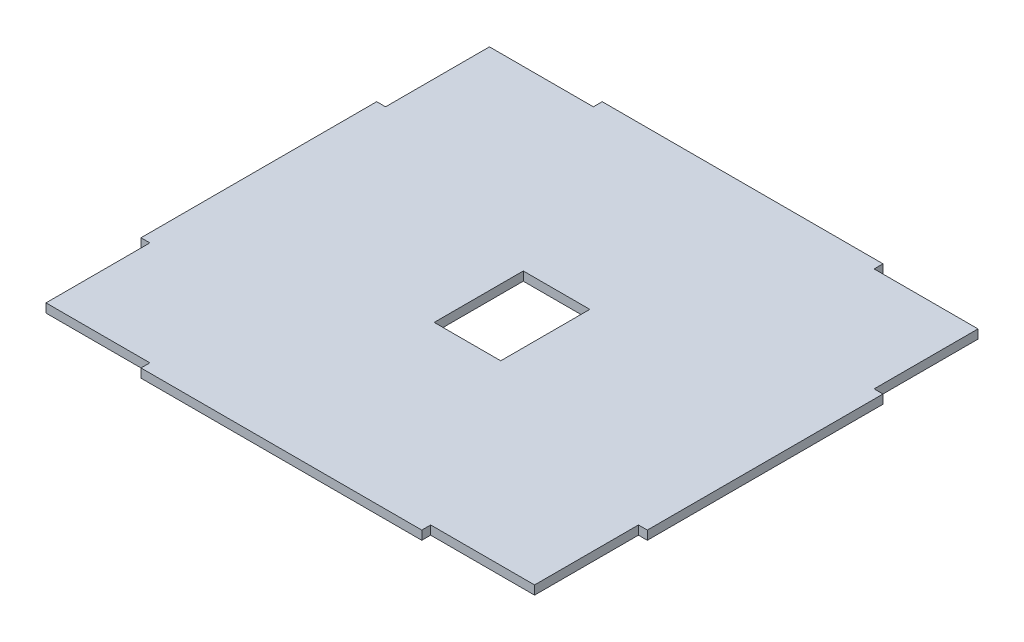
ISO-10303-21;
HEADER;
FILE_DESCRIPTION(('STEP AP214'),'2;1');
FILE_NAME('part.step','',(''),(''),'','','');
FILE_SCHEMA(('AUTOMOTIVE_DESIGN { 1 0 10303 214 1 1 1 1 }'));
ENDSEC;
DATA;
#1=APPLICATION_CONTEXT('core data for automotive mechanical design processes');
#2=APPLICATION_PROTOCOL_DEFINITION('international standard','automotive_design',2000,#1);
#3=PRODUCT_CONTEXT('',#1,'mechanical');
#4=PRODUCT('Part','Part','',(#3));
#5=PRODUCT_RELATED_PRODUCT_CATEGORY('part','',(#4));
#6=PRODUCT_DEFINITION_FORMATION('','',#4);
#7=PRODUCT_DEFINITION_CONTEXT('part definition',#1,'design');
#8=PRODUCT_DEFINITION('design','',#6,#7);
#9=PRODUCT_DEFINITION_SHAPE('','',#8);
#10=(LENGTH_UNIT() NAMED_UNIT(*) SI_UNIT(.MILLI.,.METRE.));
#11=(NAMED_UNIT(*) PLANE_ANGLE_UNIT() SI_UNIT($,.RADIAN.));
#12=(NAMED_UNIT(*) SI_UNIT($,.STERADIAN.) SOLID_ANGLE_UNIT());
#13=UNCERTAINTY_MEASURE_WITH_UNIT(LENGTH_MEASURE(1.E-05),#10,'distance_accuracy_value','');
#14=(GEOMETRIC_REPRESENTATION_CONTEXT(3) GLOBAL_UNCERTAINTY_ASSIGNED_CONTEXT((#13)) GLOBAL_UNIT_ASSIGNED_CONTEXT((#10,
#11,#12)) REPRESENTATION_CONTEXT('',''));
#15=CARTESIAN_POINT('',(0.,0.,0.));
#16=DIRECTION('',(0.,0.,1.));
#17=DIRECTION('',(1.,0.,0.));
#18=AXIS2_PLACEMENT_3D('',#15,#16,#17);
#19=CARTESIAN_POINT('',(0.,2.,-49.943));
#20=DIRECTION('',(0.,0.,-1.));
#21=DIRECTION('',(-1.,0.,0.));
#22=AXIS2_PLACEMENT_3D('',#19,#20,#21);
#23=PLANE('',#22);
#24=DIRECTION('',(1.,0.,0.));
#25=VECTOR('',#24,1.);
#26=CARTESIAN_POINT('',(0.,0.,-49.943));
#27=LINE('',#26,#25);
#28=CARTESIAN_POINT('',(31.623,0.,-49.943));
#29=VERTEX_POINT('',#28);
#30=CARTESIAN_POINT('',(55.023,0.,-49.943));
#31=VERTEX_POINT('',#30);
#32=EDGE_CURVE('E246',#29,#31,#27,.T.);
#33=ORIENTED_EDGE('',*,*,#32,.F.);
#34=DIRECTION('',(0.,-1.,0.));
#35=VECTOR('',#34,1.);
#36=CARTESIAN_POINT('',(31.623,2.,-49.943));
#37=LINE('',#36,#35);
#38=CARTESIAN_POINT('',(31.623,2.,-49.943));
#39=VERTEX_POINT('',#38);
#40=EDGE_CURVE('E11',#39,#29,#37,.T.);
#41=ORIENTED_EDGE('',*,*,#40,.F.);
#42=DIRECTION('',(1.,0.,0.));
#43=VECTOR('',#42,1.);
#44=CARTESIAN_POINT('',(0.,2.,-49.943));
#45=LINE('',#44,#43);
#46=CARTESIAN_POINT('',(55.023,2.,-49.943));
#47=VERTEX_POINT('',#46);
#48=EDGE_CURVE('E364',#39,#47,#45,.T.);
#49=ORIENTED_EDGE('',*,*,#48,.T.);
#50=DIRECTION('',(0.,-1.,0.));
#51=VECTOR('',#50,1.);
#52=CARTESIAN_POINT('',(55.023,2.,-49.943));
#53=LINE('',#52,#51);
#54=EDGE_CURVE('E140',#47,#31,#53,.T.);
#55=ORIENTED_EDGE('',*,*,#54,.T.);
#56=EDGE_LOOP('',(#33,#41,#49,#55));
#57=FACE_BOUND('',#56,.T.);
#58=ADVANCED_FACE('F39',(#57),#23,.T.);
#59=CARTESIAN_POINT('',(31.6229999999998,2.,1.09714320961628E-13));
#60=DIRECTION('',(1.,0.,0.));
#61=DIRECTION('',(0.,0.,-1.));
#62=AXIS2_PLACEMENT_3D('',#59,#60,#61);
#63=PLANE('',#62);
#64=DIRECTION('',(0.,0.,1.));
#65=VECTOR('',#64,1.);
#66=CARTESIAN_POINT('',(31.6229999999998,0.,1.09714320961628E-13));
#67=LINE('',#66,#65);
#68=CARTESIAN_POINT('',(31.623,0.,-51.943));
#69=VERTEX_POINT('',#68);
#70=EDGE_CURVE('E249',#69,#29,#67,.T.);
#71=ORIENTED_EDGE('',*,*,#70,.F.);
#72=DIRECTION('',(0.,-1.,0.));
#73=VECTOR('',#72,1.);
#74=CARTESIAN_POINT('',(31.623,2.,-51.943));
#75=LINE('',#74,#73);
#76=CARTESIAN_POINT('',(31.623,2.,-51.943));
#77=VERTEX_POINT('',#76);
#78=EDGE_CURVE('E49',#77,#69,#75,.T.);
#79=ORIENTED_EDGE('',*,*,#78,.F.);
#80=DIRECTION('',(0.,0.,1.));
#81=VECTOR('',#80,1.);
#82=CARTESIAN_POINT('',(31.6229999999998,2.,1.09714320961628E-13));
#83=LINE('',#82,#81);
#84=EDGE_CURVE('E367',#77,#39,#83,.T.);
#85=ORIENTED_EDGE('',*,*,#84,.T.);
#86=ORIENTED_EDGE('',*,*,#40,.T.);
#87=EDGE_LOOP('',(#71,#79,#85,#86));
#88=FACE_BOUND('',#87,.T.);
#89=ADVANCED_FACE('F425',(#88),#63,.T.);
#90=CARTESIAN_POINT('',(0.,2.,-51.943));
#91=DIRECTION('',(0.,0.,-1.));
#92=DIRECTION('',(-1.,0.,0.));
#93=AXIS2_PLACEMENT_3D('',#90,#91,#92);
#94=PLANE('',#93);
#95=DIRECTION('',(1.,0.,0.));
#96=VECTOR('',#95,1.);
#97=CARTESIAN_POINT('',(0.,0.,-51.943));
#98=LINE('',#97,#96);
#99=CARTESIAN_POINT('',(-31.623,0.,-51.943));
#100=VERTEX_POINT('',#99);
#101=EDGE_CURVE('E252',#100,#69,#98,.T.);
#102=ORIENTED_EDGE('',*,*,#101,.F.);
#103=DIRECTION('',(0.,-1.,0.));
#104=VECTOR('',#103,1.);
#105=CARTESIAN_POINT('',(-31.623,2.,-51.943));
#106=LINE('',#105,#104);
#107=CARTESIAN_POINT('',(-31.623,2.,-51.943));
#108=VERTEX_POINT('',#107);
#109=EDGE_CURVE('E336',#108,#100,#106,.T.);
#110=ORIENTED_EDGE('',*,*,#109,.F.);
#111=DIRECTION('',(1.,0.,0.));
#112=VECTOR('',#111,1.);
#113=CARTESIAN_POINT('',(0.,2.,-51.943));
#114=LINE('',#113,#112);
#115=EDGE_CURVE('E374',#108,#77,#114,.T.);
#116=ORIENTED_EDGE('',*,*,#115,.T.);
#117=ORIENTED_EDGE('',*,*,#78,.T.);
#118=EDGE_LOOP('',(#102,#110,#116,#117));
#119=FACE_BOUND('',#118,.T.);
#120=ADVANCED_FACE('F428',(#119),#94,.T.);
#121=CARTESIAN_POINT('',(-31.6230000000002,2.,-1.0971432096163E-13));
#122=DIRECTION('',(1.,0.,0.));
#123=DIRECTION('',(0.,0.,-1.));
#124=AXIS2_PLACEMENT_3D('',#121,#122,#123);
#125=PLANE('',#124);
#126=DIRECTION('',(0.,0.,1.));
#127=VECTOR('',#126,1.);
#128=CARTESIAN_POINT('',(-31.6230000000002,0.,-1.0971432096163E-13));
#129=LINE('',#128,#127);
#130=CARTESIAN_POINT('',(-31.623,0.,-49.943));
#131=VERTEX_POINT('',#130);
#132=EDGE_CURVE('E255',#100,#131,#129,.T.);
#133=ORIENTED_EDGE('',*,*,#132,.T.);
#134=DIRECTION('',(0.,-1.,0.));
#135=VECTOR('',#134,1.);
#136=CARTESIAN_POINT('',(-31.623,2.,-49.943));
#137=LINE('',#136,#135);
#138=CARTESIAN_POINT('',(-31.623,2.,-49.943));
#139=VERTEX_POINT('',#138);
#140=EDGE_CURVE('E334',#139,#131,#137,.T.);
#141=ORIENTED_EDGE('',*,*,#140,.F.);
#142=DIRECTION('',(0.,0.,1.));
#143=VECTOR('',#142,1.);
#144=CARTESIAN_POINT('',(-31.6230000000002,2.,-1.0971432096163E-13));
#145=LINE('',#144,#143);
#146=EDGE_CURVE('E377',#108,#139,#145,.T.);
#147=ORIENTED_EDGE('',*,*,#146,.F.);
#148=ORIENTED_EDGE('',*,*,#109,.T.);
#149=EDGE_LOOP('',(#133,#141,#147,#148));
#150=FACE_BOUND('',#149,.T.);
#151=ADVANCED_FACE('F434',(#150),#125,.F.);
#152=CARTESIAN_POINT('',(0.,2.,-49.943));
#153=DIRECTION('',(0.,0.,-1.));
#154=DIRECTION('',(-1.,0.,0.));
#155=AXIS2_PLACEMENT_3D('',#152,#153,#154);
#156=PLANE('',#155);
#157=DIRECTION('',(1.,0.,0.));
#158=VECTOR('',#157,1.);
#159=CARTESIAN_POINT('',(0.,0.,-49.943));
#160=LINE('',#159,#158);
#161=CARTESIAN_POINT('',(-55.023,0.,-49.943));
#162=VERTEX_POINT('',#161);
#163=EDGE_CURVE('E258',#162,#131,#160,.T.);
#164=ORIENTED_EDGE('',*,*,#163,.F.);
#165=DIRECTION('',(0.,-1.,0.));
#166=VECTOR('',#165,1.);
#167=CARTESIAN_POINT('',(-55.023,2.,-49.943));
#168=LINE('',#167,#166);
#169=CARTESIAN_POINT('',(-55.023,2.,-49.943));
#170=VERTEX_POINT('',#169);
#171=EDGE_CURVE('E332',#170,#162,#168,.T.);
#172=ORIENTED_EDGE('',*,*,#171,.F.);
#173=DIRECTION('',(1.,0.,0.));
#174=VECTOR('',#173,1.);
#175=CARTESIAN_POINT('',(0.,2.,-49.943));
#176=LINE('',#175,#174);
#177=EDGE_CURVE('E379',#170,#139,#176,.T.);
#178=ORIENTED_EDGE('',*,*,#177,.T.);
#179=ORIENTED_EDGE('',*,*,#140,.T.);
#180=EDGE_LOOP('',(#164,#172,#178,#179));
#181=FACE_BOUND('',#180,.T.);
#182=ADVANCED_FACE('F438',(#181),#156,.T.);
#183=CARTESIAN_POINT('',(-55.023,2.,0.));
#184=DIRECTION('',(-1.,0.,0.));
#185=DIRECTION('',(0.,0.,1.));
#186=AXIS2_PLACEMENT_3D('',#183,#184,#185);
#187=PLANE('',#186);
#188=DIRECTION('',(0.,0.,-1.));
#189=VECTOR('',#188,1.);
#190=CARTESIAN_POINT('',(-55.023,0.,0.));
#191=LINE('',#190,#189);
#192=CARTESIAN_POINT('',(-55.023,0.,-26.543));
#193=VERTEX_POINT('',#192);
#194=EDGE_CURVE('E261',#193,#162,#191,.T.);
#195=ORIENTED_EDGE('',*,*,#194,.F.);
#196=DIRECTION('',(0.,-1.,0.));
#197=VECTOR('',#196,1.);
#198=CARTESIAN_POINT('',(-55.023,2.,-26.543));
#199=LINE('',#198,#197);
#200=CARTESIAN_POINT('',(-55.023,2.,-26.543));
#201=VERTEX_POINT('',#200);
#202=EDGE_CURVE('E330',#201,#193,#199,.T.);
#203=ORIENTED_EDGE('',*,*,#202,.F.);
#204=DIRECTION('',(0.,0.,-1.));
#205=VECTOR('',#204,1.);
#206=CARTESIAN_POINT('',(-55.023,2.,0.));
#207=LINE('',#206,#205);
#208=EDGE_CURVE('E382',#201,#170,#207,.T.);
#209=ORIENTED_EDGE('',*,*,#208,.T.);
#210=ORIENTED_EDGE('',*,*,#171,.T.);
#211=EDGE_LOOP('',(#195,#203,#209,#210));
#212=FACE_BOUND('',#211,.T.);
#213=ADVANCED_FACE('F441',(#212),#187,.T.);
#214=CARTESIAN_POINT('',(0.,2.,-26.5430000000001));
#215=DIRECTION('',(0.,0.,-1.));
#216=DIRECTION('',(-1.,0.,0.));
#217=AXIS2_PLACEMENT_3D('',#214,#215,#216);
#218=PLANE('',#217);
#219=DIRECTION('',(1.,0.,0.));
#220=VECTOR('',#219,1.);
#221=CARTESIAN_POINT('',(0.,0.,-26.5430000000001));
#222=LINE('',#221,#220);
#223=CARTESIAN_POINT('',(-57.023,0.,-26.543));
#224=VERTEX_POINT('',#223);
#225=EDGE_CURVE('E264',#224,#193,#222,.T.);
#226=ORIENTED_EDGE('',*,*,#225,.F.);
#227=DIRECTION('',(0.,-1.,0.));
#228=VECTOR('',#227,1.);
#229=CARTESIAN_POINT('',(-57.023,2.,-26.543));
#230=LINE('',#229,#228);
#231=CARTESIAN_POINT('',(-57.023,2.,-26.543));
#232=VERTEX_POINT('',#231);
#233=EDGE_CURVE('E328',#232,#224,#230,.T.);
#234=ORIENTED_EDGE('',*,*,#233,.F.);
#235=DIRECTION('',(1.,0.,0.));
#236=VECTOR('',#235,1.);
#237=CARTESIAN_POINT('',(0.,2.,-26.5430000000001));
#238=LINE('',#237,#236);
#239=EDGE_CURVE('E385',#232,#201,#238,.T.);
#240=ORIENTED_EDGE('',*,*,#239,.T.);
#241=ORIENTED_EDGE('',*,*,#202,.T.);
#242=EDGE_LOOP('',(#226,#234,#240,#241));
#243=FACE_BOUND('',#242,.T.);
#244=ADVANCED_FACE('F446',(#243),#218,.T.);
#245=CARTESIAN_POINT('',(-57.023,2.,0.));
#246=DIRECTION('',(-1.,0.,0.));
#247=DIRECTION('',(0.,0.,1.));
#248=AXIS2_PLACEMENT_3D('',#245,#246,#247);
#249=PLANE('',#248);
#250=DIRECTION('',(0.,0.,-1.));
#251=VECTOR('',#250,1.);
#252=CARTESIAN_POINT('',(-57.023,0.,0.));
#253=LINE('',#252,#251);
#254=CARTESIAN_POINT('',(-57.023,0.,26.543));
#255=VERTEX_POINT('',#254);
#256=EDGE_CURVE('E267',#255,#224,#253,.T.);
#257=ORIENTED_EDGE('',*,*,#256,.F.);
#258=DIRECTION('',(0.,-1.,0.));
#259=VECTOR('',#258,1.);
#260=CARTESIAN_POINT('',(-57.023,2.,26.543));
#261=LINE('',#260,#259);
#262=CARTESIAN_POINT('',(-57.023,2.,26.543));
#263=VERTEX_POINT('',#262);
#264=EDGE_CURVE('E326',#263,#255,#261,.T.);
#265=ORIENTED_EDGE('',*,*,#264,.F.);
#266=DIRECTION('',(0.,0.,-1.));
#267=VECTOR('',#266,1.);
#268=CARTESIAN_POINT('',(-57.023,2.,0.));
#269=LINE('',#268,#267);
#270=EDGE_CURVE('E388',#263,#232,#269,.T.);
#271=ORIENTED_EDGE('',*,*,#270,.T.);
#272=ORIENTED_EDGE('',*,*,#233,.T.);
#273=EDGE_LOOP('',(#257,#265,#271,#272));
#274=FACE_BOUND('',#273,.T.);
#275=ADVANCED_FACE('F449',(#274),#249,.T.);
#276=CARTESIAN_POINT('',(0.,2.,26.543));
#277=DIRECTION('',(0.,0.,-1.));
#278=DIRECTION('',(-1.,0.,0.));
#279=AXIS2_PLACEMENT_3D('',#276,#277,#278);
#280=PLANE('',#279);
#281=DIRECTION('',(1.,0.,0.));
#282=VECTOR('',#281,1.);
#283=CARTESIAN_POINT('',(0.,0.,26.543));
#284=LINE('',#283,#282);
#285=CARTESIAN_POINT('',(-55.023,0.,26.543));
#286=VERTEX_POINT('',#285);
#287=EDGE_CURVE('E270',#255,#286,#284,.T.);
#288=ORIENTED_EDGE('',*,*,#287,.T.);
#289=DIRECTION('',(0.,-1.,0.));
#290=VECTOR('',#289,1.);
#291=CARTESIAN_POINT('',(-55.023,2.,26.543));
#292=LINE('',#291,#290);
#293=CARTESIAN_POINT('',(-55.023,2.,26.543));
#294=VERTEX_POINT('',#293);
#295=EDGE_CURVE('E324',#294,#286,#292,.T.);
#296=ORIENTED_EDGE('',*,*,#295,.F.);
#297=DIRECTION('',(1.,0.,0.));
#298=VECTOR('',#297,1.);
#299=CARTESIAN_POINT('',(0.,2.,26.543));
#300=LINE('',#299,#298);
#301=EDGE_CURVE('E391',#263,#294,#300,.T.);
#302=ORIENTED_EDGE('',*,*,#301,.F.);
#303=ORIENTED_EDGE('',*,*,#264,.T.);
#304=EDGE_LOOP('',(#288,#296,#302,#303));
#305=FACE_BOUND('',#304,.T.);
#306=ADVANCED_FACE('F454',(#305),#280,.F.);
#307=CARTESIAN_POINT('',(-55.023,2.,0.));
#308=DIRECTION('',(-1.,0.,0.));
#309=DIRECTION('',(0.,0.,1.));
#310=AXIS2_PLACEMENT_3D('',#307,#308,#309);
#311=PLANE('',#310);
#312=DIRECTION('',(0.,0.,-1.));
#313=VECTOR('',#312,1.);
#314=CARTESIAN_POINT('',(-55.023,0.,0.));
#315=LINE('',#314,#313);
#316=CARTESIAN_POINT('',(-55.023,0.,49.943));
#317=VERTEX_POINT('',#316);
#318=EDGE_CURVE('E273',#317,#286,#315,.T.);
#319=ORIENTED_EDGE('',*,*,#318,.F.);
#320=DIRECTION('',(0.,-1.,0.));
#321=VECTOR('',#320,1.);
#322=CARTESIAN_POINT('',(-55.023,2.,49.943));
#323=LINE('',#322,#321);
#324=CARTESIAN_POINT('',(-55.023,2.,49.943));
#325=VERTEX_POINT('',#324);
#326=EDGE_CURVE('E322',#325,#317,#323,.T.);
#327=ORIENTED_EDGE('',*,*,#326,.F.);
#328=DIRECTION('',(0.,0.,-1.));
#329=VECTOR('',#328,1.);
#330=CARTESIAN_POINT('',(-55.023,2.,0.));
#331=LINE('',#330,#329);
#332=EDGE_CURVE('E393',#325,#294,#331,.T.);
#333=ORIENTED_EDGE('',*,*,#332,.T.);
#334=ORIENTED_EDGE('',*,*,#295,.T.);
#335=EDGE_LOOP('',(#319,#327,#333,#334));
#336=FACE_BOUND('',#335,.T.);
#337=ADVANCED_FACE('F458',(#336),#311,.T.);
#338=CARTESIAN_POINT('',(0.,2.,49.943));
#339=DIRECTION('',(0.,0.,-1.));
#340=DIRECTION('',(-1.,0.,0.));
#341=AXIS2_PLACEMENT_3D('',#338,#339,#340);
#342=PLANE('',#341);
#343=DIRECTION('',(1.,0.,0.));
#344=VECTOR('',#343,1.);
#345=CARTESIAN_POINT('',(0.,0.,49.943));
#346=LINE('',#345,#344);
#347=CARTESIAN_POINT('',(-31.623,0.,49.943));
#348=VERTEX_POINT('',#347);
#349=EDGE_CURVE('E276',#317,#348,#346,.T.);
#350=ORIENTED_EDGE('',*,*,#349,.T.);
#351=DIRECTION('',(0.,-1.,0.));
#352=VECTOR('',#351,1.);
#353=CARTESIAN_POINT('',(-31.623,2.,49.943));
#354=LINE('',#353,#352);
#355=CARTESIAN_POINT('',(-31.623,2.,49.943));
#356=VERTEX_POINT('',#355);
#357=EDGE_CURVE('E319',#356,#348,#354,.T.);
#358=ORIENTED_EDGE('',*,*,#357,.F.);
#359=DIRECTION('',(1.,0.,0.));
#360=VECTOR('',#359,1.);
#361=CARTESIAN_POINT('',(0.,2.,49.943));
#362=LINE('',#361,#360);
#363=EDGE_CURVE('E396',#325,#356,#362,.T.);
#364=ORIENTED_EDGE('',*,*,#363,.F.);
#365=ORIENTED_EDGE('',*,*,#326,.T.);
#366=EDGE_LOOP('',(#350,#358,#364,#365));
#367=FACE_BOUND('',#366,.T.);
#368=ADVANCED_FACE('F463',(#367),#342,.F.);
#369=CARTESIAN_POINT('',(-31.6230000000002,2.,1.0971432096163E-13));
#370=DIRECTION('',(1.,0.,0.));
#371=DIRECTION('',(0.,0.,-1.));
#372=AXIS2_PLACEMENT_3D('',#369,#370,#371);
#373=PLANE('',#372);
#374=DIRECTION('',(0.,0.,1.));
#375=VECTOR('',#374,1.);
#376=CARTESIAN_POINT('',(-31.6230000000002,0.,1.0971432096163E-13));
#377=LINE('',#376,#375);
#378=CARTESIAN_POINT('',(-31.623,0.,51.943));
#379=VERTEX_POINT('',#378);
#380=EDGE_CURVE('E279',#348,#379,#377,.T.);
#381=ORIENTED_EDGE('',*,*,#380,.T.);
#382=DIRECTION('',(0.,-1.,0.));
#383=VECTOR('',#382,1.);
#384=CARTESIAN_POINT('',(-31.623,2.,51.943));
#385=LINE('',#384,#383);
#386=CARTESIAN_POINT('',(-31.623,2.,51.943));
#387=VERTEX_POINT('',#386);
#388=EDGE_CURVE('E316',#387,#379,#385,.T.);
#389=ORIENTED_EDGE('',*,*,#388,.F.);
#390=DIRECTION('',(0.,0.,1.));
#391=VECTOR('',#390,1.);
#392=CARTESIAN_POINT('',(-31.6230000000002,2.,1.0971432096163E-13));
#393=LINE('',#392,#391);
#394=EDGE_CURVE('E399',#356,#387,#393,.T.);
#395=ORIENTED_EDGE('',*,*,#394,.F.);
#396=ORIENTED_EDGE('',*,*,#357,.T.);
#397=EDGE_LOOP('',(#381,#389,#395,#396));
#398=FACE_BOUND('',#397,.T.);
#399=ADVANCED_FACE('F467',(#398),#373,.F.);
#400=CARTESIAN_POINT('',(0.,2.,51.943));
#401=DIRECTION('',(0.,0.,-1.));
#402=DIRECTION('',(-1.,0.,0.));
#403=AXIS2_PLACEMENT_3D('',#400,#401,#402);
#404=PLANE('',#403);
#405=DIRECTION('',(1.,0.,0.));
#406=VECTOR('',#405,1.);
#407=CARTESIAN_POINT('',(0.,0.,51.943));
#408=LINE('',#407,#406);
#409=CARTESIAN_POINT('',(31.623,0.,51.943));
#410=VERTEX_POINT('',#409);
#411=EDGE_CURVE('E282',#379,#410,#408,.T.);
#412=ORIENTED_EDGE('',*,*,#411,.T.);
#413=DIRECTION('',(0.,-1.,0.));
#414=VECTOR('',#413,1.);
#415=CARTESIAN_POINT('',(31.623,2.,51.943));
#416=LINE('',#415,#414);
#417=CARTESIAN_POINT('',(31.623,2.,51.943));
#418=VERTEX_POINT('',#417);
#419=EDGE_CURVE('E314',#418,#410,#416,.T.);
#420=ORIENTED_EDGE('',*,*,#419,.F.);
#421=DIRECTION('',(1.,0.,0.));
#422=VECTOR('',#421,1.);
#423=CARTESIAN_POINT('',(0.,2.,51.943));
#424=LINE('',#423,#422);
#425=EDGE_CURVE('E402',#387,#418,#424,.T.);
#426=ORIENTED_EDGE('',*,*,#425,.F.);
#427=ORIENTED_EDGE('',*,*,#388,.T.);
#428=EDGE_LOOP('',(#412,#420,#426,#427));
#429=FACE_BOUND('',#428,.T.);
#430=ADVANCED_FACE('F469',(#429),#404,.F.);
#431=CARTESIAN_POINT('',(31.6229999999998,2.,-1.09714320961628E-13));
#432=DIRECTION('',(1.,0.,0.));
#433=DIRECTION('',(0.,0.,-1.));
#434=AXIS2_PLACEMENT_3D('',#431,#432,#433);
#435=PLANE('',#434);
#436=DIRECTION('',(0.,0.,1.));
#437=VECTOR('',#436,1.);
#438=CARTESIAN_POINT('',(31.6229999999998,0.,-1.09714320961628E-13));
#439=LINE('',#438,#437);
#440=CARTESIAN_POINT('',(31.623,0.,49.943));
#441=VERTEX_POINT('',#440);
#442=EDGE_CURVE('E285',#441,#410,#439,.T.);
#443=ORIENTED_EDGE('',*,*,#442,.F.);
#444=DIRECTION('',(0.,-1.,0.));
#445=VECTOR('',#444,1.);
#446=CARTESIAN_POINT('',(31.623,2.,49.943));
#447=LINE('',#446,#445);
#448=CARTESIAN_POINT('',(31.623,2.,49.943));
#449=VERTEX_POINT('',#448);
#450=EDGE_CURVE('E312',#449,#441,#447,.T.);
#451=ORIENTED_EDGE('',*,*,#450,.F.);
#452=DIRECTION('',(0.,0.,1.));
#453=VECTOR('',#452,1.);
#454=CARTESIAN_POINT('',(31.6229999999998,2.,-1.09714320961628E-13));
#455=LINE('',#454,#453);
#456=EDGE_CURVE('E404',#449,#418,#455,.T.);
#457=ORIENTED_EDGE('',*,*,#456,.T.);
#458=ORIENTED_EDGE('',*,*,#419,.T.);
#459=EDGE_LOOP('',(#443,#451,#457,#458));
#460=FACE_BOUND('',#459,.T.);
#461=ADVANCED_FACE('F472',(#460),#435,.T.);
#462=CARTESIAN_POINT('',(0.,2.,49.943));
#463=DIRECTION('',(0.,0.,-1.));
#464=DIRECTION('',(-1.,0.,0.));
#465=AXIS2_PLACEMENT_3D('',#462,#463,#464);
#466=PLANE('',#465);
#467=DIRECTION('',(1.,0.,0.));
#468=VECTOR('',#467,1.);
#469=CARTESIAN_POINT('',(0.,0.,49.943));
#470=LINE('',#469,#468);
#471=CARTESIAN_POINT('',(55.023,0.,49.943));
#472=VERTEX_POINT('',#471);
#473=EDGE_CURVE('E288',#441,#472,#470,.T.);
#474=ORIENTED_EDGE('',*,*,#473,.T.);
#475=DIRECTION('',(0.,-1.,0.));
#476=VECTOR('',#475,1.);
#477=CARTESIAN_POINT('',(55.023,2.,49.943));
#478=LINE('',#477,#476);
#479=CARTESIAN_POINT('',(55.023,2.,49.943));
#480=VERTEX_POINT('',#479);
#481=EDGE_CURVE('E309',#480,#472,#478,.T.);
#482=ORIENTED_EDGE('',*,*,#481,.F.);
#483=DIRECTION('',(1.,0.,0.));
#484=VECTOR('',#483,1.);
#485=CARTESIAN_POINT('',(0.,2.,49.943));
#486=LINE('',#485,#484);
#487=EDGE_CURVE('E407',#449,#480,#486,.T.);
#488=ORIENTED_EDGE('',*,*,#487,.F.);
#489=ORIENTED_EDGE('',*,*,#450,.T.);
#490=EDGE_LOOP('',(#474,#482,#488,#489));
#491=FACE_BOUND('',#490,.T.);
#492=ADVANCED_FACE('F474',(#491),#466,.F.);
#493=CARTESIAN_POINT('',(55.023,2.,0.));
#494=DIRECTION('',(-1.,0.,0.));
#495=DIRECTION('',(0.,0.,1.));
#496=AXIS2_PLACEMENT_3D('',#493,#494,#495);
#497=PLANE('',#496);
#498=DIRECTION('',(0.,0.,-1.));
#499=VECTOR('',#498,1.);
#500=CARTESIAN_POINT('',(55.023,0.,0.));
#501=LINE('',#500,#499);
#502=CARTESIAN_POINT('',(55.023,0.,26.543));
#503=VERTEX_POINT('',#502);
#504=EDGE_CURVE('E291',#472,#503,#501,.T.);
#505=ORIENTED_EDGE('',*,*,#504,.T.);
#506=DIRECTION('',(0.,-1.,0.));
#507=VECTOR('',#506,1.);
#508=CARTESIAN_POINT('',(55.023,2.,26.543));
#509=LINE('',#508,#507);
#510=CARTESIAN_POINT('',(55.023,2.,26.543));
#511=VERTEX_POINT('',#510);
#512=EDGE_CURVE('E306',#511,#503,#509,.T.);
#513=ORIENTED_EDGE('',*,*,#512,.F.);
#514=DIRECTION('',(0.,0.,-1.));
#515=VECTOR('',#514,1.);
#516=CARTESIAN_POINT('',(55.023,2.,0.));
#517=LINE('',#516,#515);
#518=EDGE_CURVE('E410',#480,#511,#517,.T.);
#519=ORIENTED_EDGE('',*,*,#518,.F.);
#520=ORIENTED_EDGE('',*,*,#481,.T.);
#521=EDGE_LOOP('',(#505,#513,#519,#520));
#522=FACE_BOUND('',#521,.T.);
#523=ADVANCED_FACE('F416',(#522),#497,.F.);
#524=CARTESIAN_POINT('',(0.,2.,26.5430000000001));
#525=DIRECTION('',(0.,0.,-1.));
#526=DIRECTION('',(-1.,0.,0.));
#527=AXIS2_PLACEMENT_3D('',#524,#525,#526);
#528=PLANE('',#527);
#529=DIRECTION('',(1.,0.,0.));
#530=VECTOR('',#529,1.);
#531=CARTESIAN_POINT('',(0.,0.,26.5430000000001));
#532=LINE('',#531,#530);
#533=CARTESIAN_POINT('',(57.023,0.,26.543));
#534=VERTEX_POINT('',#533);
#535=EDGE_CURVE('E294',#503,#534,#532,.T.);
#536=ORIENTED_EDGE('',*,*,#535,.T.);
#537=DIRECTION('',(0.,-1.,0.));
#538=VECTOR('',#537,1.);
#539=CARTESIAN_POINT('',(57.023,2.,26.543));
#540=LINE('',#539,#538);
#541=CARTESIAN_POINT('',(57.023,2.,26.543));
#542=VERTEX_POINT('',#541);
#543=EDGE_CURVE('E227',#542,#534,#540,.T.);
#544=ORIENTED_EDGE('',*,*,#543,.F.);
#545=DIRECTION('',(1.,0.,0.));
#546=VECTOR('',#545,1.);
#547=CARTESIAN_POINT('',(0.,2.,26.5430000000001));
#548=LINE('',#547,#546);
#549=EDGE_CURVE('E215',#511,#542,#548,.T.);
#550=ORIENTED_EDGE('',*,*,#549,.F.);
#551=ORIENTED_EDGE('',*,*,#512,.T.);
#552=EDGE_LOOP('',(#536,#544,#550,#551));
#553=FACE_BOUND('',#552,.T.);
#554=ADVANCED_FACE('F418',(#553),#528,.F.);
#555=CARTESIAN_POINT('',(57.023,2.,0.));
#556=DIRECTION('',(-1.,0.,0.));
#557=DIRECTION('',(0.,0.,1.));
#558=AXIS2_PLACEMENT_3D('',#555,#556,#557);
#559=PLANE('',#558);
#560=DIRECTION('',(0.,0.,-1.));
#561=VECTOR('',#560,1.);
#562=CARTESIAN_POINT('',(57.023,0.,0.));
#563=LINE('',#562,#561);
#564=CARTESIAN_POINT('',(57.023,0.,-26.543));
#565=VERTEX_POINT('',#564);
#566=EDGE_CURVE('E223',#534,#565,#563,.T.);
#567=ORIENTED_EDGE('',*,*,#566,.T.);
#568=DIRECTION('',(0.,-1.,0.));
#569=VECTOR('',#568,1.);
#570=CARTESIAN_POINT('',(57.023,2.,-26.543));
#571=LINE('',#570,#569);
#572=CARTESIAN_POINT('',(57.023,2.,-26.543));
#573=VERTEX_POINT('',#572);
#574=EDGE_CURVE('E221',#573,#565,#571,.T.);
#575=ORIENTED_EDGE('',*,*,#574,.F.);
#576=DIRECTION('',(0.,0.,-1.));
#577=VECTOR('',#576,1.);
#578=CARTESIAN_POINT('',(57.023,2.,0.));
#579=LINE('',#578,#577);
#580=EDGE_CURVE('E209',#542,#573,#579,.T.);
#581=ORIENTED_EDGE('',*,*,#580,.F.);
#582=ORIENTED_EDGE('',*,*,#543,.T.);
#583=EDGE_LOOP('',(#567,#575,#581,#582));
#584=FACE_BOUND('',#583,.T.);
#585=ADVANCED_FACE('F222',(#584),#559,.F.);
#586=CARTESIAN_POINT('',(0.,2.,-26.5429999999999));
#587=DIRECTION('',(0.,0.,-1.));
#588=DIRECTION('',(-1.,0.,0.));
#589=AXIS2_PLACEMENT_3D('',#586,#587,#588);
#590=PLANE('',#589);
#591=DIRECTION('',(1.,0.,0.));
#592=VECTOR('',#591,1.);
#593=CARTESIAN_POINT('',(0.,0.,-26.5429999999999));
#594=LINE('',#593,#592);
#595=CARTESIAN_POINT('',(55.023,0.,-26.543));
#596=VERTEX_POINT('',#595);
#597=EDGE_CURVE('E298',#596,#565,#594,.T.);
#598=ORIENTED_EDGE('',*,*,#597,.F.);
#599=DIRECTION('',(0.,-1.,0.));
#600=VECTOR('',#599,1.);
#601=CARTESIAN_POINT('',(55.023,2.,-26.543));
#602=LINE('',#601,#600);
#603=CARTESIAN_POINT('',(55.023,2.,-26.543));
#604=VERTEX_POINT('',#603);
#605=EDGE_CURVE('E133',#604,#596,#602,.T.);
#606=ORIENTED_EDGE('',*,*,#605,.F.);
#607=DIRECTION('',(1.,0.,0.));
#608=VECTOR('',#607,1.);
#609=CARTESIAN_POINT('',(0.,2.,-26.5429999999999));
#610=LINE('',#609,#608);
#611=EDGE_CURVE('E213',#604,#573,#610,.T.);
#612=ORIENTED_EDGE('',*,*,#611,.T.);
#613=ORIENTED_EDGE('',*,*,#574,.T.);
#614=EDGE_LOOP('',(#598,#606,#612,#613));
#615=FACE_BOUND('',#614,.T.);
#616=ADVANCED_FACE('F229',(#615),#590,.T.);
#617=CARTESIAN_POINT('',(7.49299999999999,2.,0.));
#618=DIRECTION('',(-1.,0.,0.));
#619=DIRECTION('',(0.,0.,1.));
#620=AXIS2_PLACEMENT_3D('',#617,#618,#619);
#621=PLANE('',#620);
#622=DIRECTION('',(0.,0.,-1.));
#623=VECTOR('',#622,1.);
#624=CARTESIAN_POINT('',(7.49299999999999,0.,0.));
#625=LINE('',#624,#623);
#626=CARTESIAN_POINT('',(7.49299999999999,0.,10.033));
#627=VERTEX_POINT('',#626);
#628=CARTESIAN_POINT('',(7.49299999999999,0.,-10.033));
#629=VERTEX_POINT('',#628);
#630=EDGE_CURVE('E235',#627,#629,#625,.T.);
#631=ORIENTED_EDGE('',*,*,#630,.F.);
#632=DIRECTION('',(0.,-1.,0.));
#633=VECTOR('',#632,1.);
#634=CARTESIAN_POINT('',(7.49299999999999,2.,10.033));
#635=LINE('',#634,#633);
#636=CARTESIAN_POINT('',(7.49299999999999,2.,10.033));
#637=VERTEX_POINT('',#636);
#638=EDGE_CURVE('E43',#637,#627,#635,.T.);
#639=ORIENTED_EDGE('',*,*,#638,.F.);
#640=DIRECTION('',(0.,0.,-1.));
#641=VECTOR('',#640,1.);
#642=CARTESIAN_POINT('',(7.49299999999999,2.,0.));
#643=LINE('',#642,#641);
#644=CARTESIAN_POINT('',(7.49299999999999,2.,-10.033));
#645=VERTEX_POINT('',#644);
#646=EDGE_CURVE('E302',#637,#645,#643,.T.);
#647=ORIENTED_EDGE('',*,*,#646,.T.);
#648=DIRECTION('',(0.,-1.,0.));
#649=VECTOR('',#648,1.);
#650=CARTESIAN_POINT('',(7.49299999999999,2.,-10.033));
#651=LINE('',#650,#649);
#652=EDGE_CURVE('E231',#645,#629,#651,.T.);
#653=ORIENTED_EDGE('',*,*,#652,.T.);
#654=EDGE_LOOP('',(#631,#639,#647,#653));
#655=FACE_BOUND('',#654,.T.);
#656=ADVANCED_FACE('F41',(#655),#621,.T.);
#657=CARTESIAN_POINT('',(0.,2.,10.033));
#658=DIRECTION('',(0.,0.,-1.));
#659=DIRECTION('',(-1.,0.,0.));
#660=AXIS2_PLACEMENT_3D('',#657,#658,#659);
#661=PLANE('',#660);
#662=DIRECTION('',(1.,0.,0.));
#663=VECTOR('',#662,1.);
#664=CARTESIAN_POINT('',(0.,0.,10.033));
#665=LINE('',#664,#663);
#666=CARTESIAN_POINT('',(-7.493,0.,10.033));
#667=VERTEX_POINT('',#666);
#668=EDGE_CURVE('E238',#667,#627,#665,.T.);
#669=ORIENTED_EDGE('',*,*,#668,.F.);
#670=DIRECTION('',(0.,-1.,0.));
#671=VECTOR('',#670,1.);
#672=CARTESIAN_POINT('',(-7.493,2.,10.033));
#673=LINE('',#672,#671);
#674=CARTESIAN_POINT('',(-7.493,2.,10.033));
#675=VERTEX_POINT('',#674);
#676=EDGE_CURVE('E342',#675,#667,#673,.T.);
#677=ORIENTED_EDGE('',*,*,#676,.F.);
#678=DIRECTION('',(1.,0.,0.));
#679=VECTOR('',#678,1.);
#680=CARTESIAN_POINT('',(0.,2.,10.033));
#681=LINE('',#680,#679);
#682=EDGE_CURVE('E351',#675,#637,#681,.T.);
#683=ORIENTED_EDGE('',*,*,#682,.T.);
#684=ORIENTED_EDGE('',*,*,#638,.T.);
#685=EDGE_LOOP('',(#669,#677,#683,#684));
#686=FACE_BOUND('',#685,.T.);
#687=ADVANCED_FACE('F349',(#686),#661,.T.);
#688=CARTESIAN_POINT('',(-7.493,2.,0.));
#689=DIRECTION('',(-1.,0.,0.));
#690=DIRECTION('',(0.,0.,1.));
#691=AXIS2_PLACEMENT_3D('',#688,#689,#690);
#692=PLANE('',#691);
#693=DIRECTION('',(0.,0.,-1.));
#694=VECTOR('',#693,1.);
#695=CARTESIAN_POINT('',(-7.493,0.,0.));
#696=LINE('',#695,#694);
#697=CARTESIAN_POINT('',(-7.493,0.,-10.033));
#698=VERTEX_POINT('',#697);
#699=EDGE_CURVE('E241',#667,#698,#696,.T.);
#700=ORIENTED_EDGE('',*,*,#699,.T.);
#701=DIRECTION('',(0.,-1.,0.));
#702=VECTOR('',#701,1.);
#703=CARTESIAN_POINT('',(-7.493,2.,-10.033));
#704=LINE('',#703,#702);
#705=CARTESIAN_POINT('',(-7.493,2.,-10.033));
#706=VERTEX_POINT('',#705);
#707=EDGE_CURVE('E340',#706,#698,#704,.T.);
#708=ORIENTED_EDGE('',*,*,#707,.F.);
#709=DIRECTION('',(0.,0.,-1.));
#710=VECTOR('',#709,1.);
#711=CARTESIAN_POINT('',(-7.493,2.,0.));
#712=LINE('',#711,#710);
#713=EDGE_CURVE('E365',#675,#706,#712,.T.);
#714=ORIENTED_EDGE('',*,*,#713,.F.);
#715=ORIENTED_EDGE('',*,*,#676,.T.);
#716=EDGE_LOOP('',(#700,#708,#714,#715));
#717=FACE_BOUND('',#716,.T.);
#718=ADVANCED_FACE('F358',(#717),#692,.F.);
#719=CARTESIAN_POINT('',(0.,2.,-10.033));
#720=DIRECTION('',(0.,0.,-1.));
#721=DIRECTION('',(-1.,0.,0.));
#722=AXIS2_PLACEMENT_3D('',#719,#720,#721);
#723=PLANE('',#722);
#724=DIRECTION('',(1.,0.,0.));
#725=VECTOR('',#724,1.);
#726=CARTESIAN_POINT('',(0.,0.,-10.033));
#727=LINE('',#726,#725);
#728=EDGE_CURVE('E243',#698,#629,#727,.T.);
#729=ORIENTED_EDGE('',*,*,#728,.T.);
#730=ORIENTED_EDGE('',*,*,#652,.F.);
#731=DIRECTION('',(1.,0.,0.));
#732=VECTOR('',#731,1.);
#733=CARTESIAN_POINT('',(0.,2.,-10.033));
#734=LINE('',#733,#732);
#735=EDGE_CURVE('E362',#706,#645,#734,.T.);
#736=ORIENTED_EDGE('',*,*,#735,.F.);
#737=ORIENTED_EDGE('',*,*,#707,.T.);
#738=EDGE_LOOP('',(#729,#730,#736,#737));
#739=FACE_BOUND('',#738,.T.);
#740=ADVANCED_FACE('F361',(#739),#723,.F.);
#741=CARTESIAN_POINT('',(55.023,2.,0.));
#742=DIRECTION('',(-1.,0.,0.));
#743=DIRECTION('',(0.,0.,1.));
#744=AXIS2_PLACEMENT_3D('',#741,#742,#743);
#745=PLANE('',#744);
#746=DIRECTION('',(0.,0.,-1.));
#747=VECTOR('',#746,1.);
#748=CARTESIAN_POINT('',(55.023,0.,0.));
#749=LINE('',#748,#747);
#750=EDGE_CURVE('E300',#596,#31,#749,.T.);
#751=ORIENTED_EDGE('',*,*,#750,.T.);
#752=ORIENTED_EDGE('',*,*,#54,.F.);
#753=DIRECTION('',(0.,0.,-1.));
#754=VECTOR('',#753,1.);
#755=CARTESIAN_POINT('',(55.023,2.,0.));
#756=LINE('',#755,#754);
#757=EDGE_CURVE('E58',#604,#47,#756,.T.);
#758=ORIENTED_EDGE('',*,*,#757,.F.);
#759=ORIENTED_EDGE('',*,*,#605,.T.);
#760=EDGE_LOOP('',(#751,#752,#758,#759));
#761=FACE_BOUND('',#760,.T.);
#762=ADVANCED_FACE('F420',(#761),#745,.F.);
#763=CARTESIAN_POINT('',(0.,2.,0.));
#764=DIRECTION('',(0.,1.,0.));
#765=DIRECTION('',(0.,0.,1.));
#766=AXIS2_PLACEMENT_3D('',#763,#764,#765);
#767=PLANE('',#766);
#768=ORIENTED_EDGE('',*,*,#646,.F.);
#769=ORIENTED_EDGE('',*,*,#682,.F.);
#770=ORIENTED_EDGE('',*,*,#713,.T.);
#771=ORIENTED_EDGE('',*,*,#735,.T.);
#772=EDGE_LOOP('',(#768,#769,#770,#771));
#773=FACE_BOUND('',#772,.T.);
#774=ORIENTED_EDGE('',*,*,#48,.F.);
#775=ORIENTED_EDGE('',*,*,#84,.F.);
#776=ORIENTED_EDGE('',*,*,#115,.F.);
#777=ORIENTED_EDGE('',*,*,#146,.T.);
#778=ORIENTED_EDGE('',*,*,#177,.F.);
#779=ORIENTED_EDGE('',*,*,#208,.F.);
#780=ORIENTED_EDGE('',*,*,#239,.F.);
#781=ORIENTED_EDGE('',*,*,#270,.F.);
#782=ORIENTED_EDGE('',*,*,#301,.T.);
#783=ORIENTED_EDGE('',*,*,#332,.F.);
#784=ORIENTED_EDGE('',*,*,#363,.T.);
#785=ORIENTED_EDGE('',*,*,#394,.T.);
#786=ORIENTED_EDGE('',*,*,#425,.T.);
#787=ORIENTED_EDGE('',*,*,#456,.F.);
#788=ORIENTED_EDGE('',*,*,#487,.T.);
#789=ORIENTED_EDGE('',*,*,#518,.T.);
#790=ORIENTED_EDGE('',*,*,#549,.T.);
#791=ORIENTED_EDGE('',*,*,#580,.T.);
#792=ORIENTED_EDGE('',*,*,#611,.F.);
#793=ORIENTED_EDGE('',*,*,#757,.T.);
#794=EDGE_LOOP('',(#774,#775,#776,#777,#778,#779,#780,#781,#782,#783,#784,#785,#786,#787,#788,
#789,#790,#791,#792,#793));
#795=FACE_BOUND('',#794,.T.);
#796=ADVANCED_FACE('F211',(#773,#795),#767,.T.);
#797=CARTESIAN_POINT('',(0.,0.,0.));
#798=DIRECTION('',(0.,1.,0.));
#799=DIRECTION('',(0.,0.,1.));
#800=AXIS2_PLACEMENT_3D('',#797,#798,#799);
#801=PLANE('',#800);
#802=ORIENTED_EDGE('',*,*,#630,.T.);
#803=ORIENTED_EDGE('',*,*,#728,.F.);
#804=ORIENTED_EDGE('',*,*,#699,.F.);
#805=ORIENTED_EDGE('',*,*,#668,.T.);
#806=EDGE_LOOP('',(#802,#803,#804,#805));
#807=FACE_BOUND('',#806,.T.);
#808=ORIENTED_EDGE('',*,*,#32,.T.);
#809=ORIENTED_EDGE('',*,*,#750,.F.);
#810=ORIENTED_EDGE('',*,*,#597,.T.);
#811=ORIENTED_EDGE('',*,*,#566,.F.);
#812=ORIENTED_EDGE('',*,*,#535,.F.);
#813=ORIENTED_EDGE('',*,*,#504,.F.);
#814=ORIENTED_EDGE('',*,*,#473,.F.);
#815=ORIENTED_EDGE('',*,*,#442,.T.);
#816=ORIENTED_EDGE('',*,*,#411,.F.);
#817=ORIENTED_EDGE('',*,*,#380,.F.);
#818=ORIENTED_EDGE('',*,*,#349,.F.);
#819=ORIENTED_EDGE('',*,*,#318,.T.);
#820=ORIENTED_EDGE('',*,*,#287,.F.);
#821=ORIENTED_EDGE('',*,*,#256,.T.);
#822=ORIENTED_EDGE('',*,*,#225,.T.);
#823=ORIENTED_EDGE('',*,*,#194,.T.);
#824=ORIENTED_EDGE('',*,*,#163,.T.);
#825=ORIENTED_EDGE('',*,*,#132,.F.);
#826=ORIENTED_EDGE('',*,*,#101,.T.);
#827=ORIENTED_EDGE('',*,*,#70,.T.);
#828=EDGE_LOOP('',(#808,#809,#810,#811,#812,#813,#814,#815,#816,#817,#818,#819,#820,#821,#822,
#823,#824,#825,#826,#827));
#829=FACE_BOUND('',#828,.T.);
#830=ADVANCED_FACE('F355',(#807,#829),#801,.F.);
#831=CLOSED_SHELL('',(#58,#89,#120,#151,#182,#213,#244,#275,#306,#337,#368,#399,#430,#461,#492,
#523,#554,#585,#616,#656,#687,#718,#740,#762,#796,#830));
#832=MANIFOLD_SOLID_BREP('B2',#831);
#833=ADVANCED_BREP_SHAPE_REPRESENTATION('',(#18,#832),#14);
#834=SHAPE_DEFINITION_REPRESENTATION(#9,#833);
ENDSEC;
END-ISO-10303-21;
